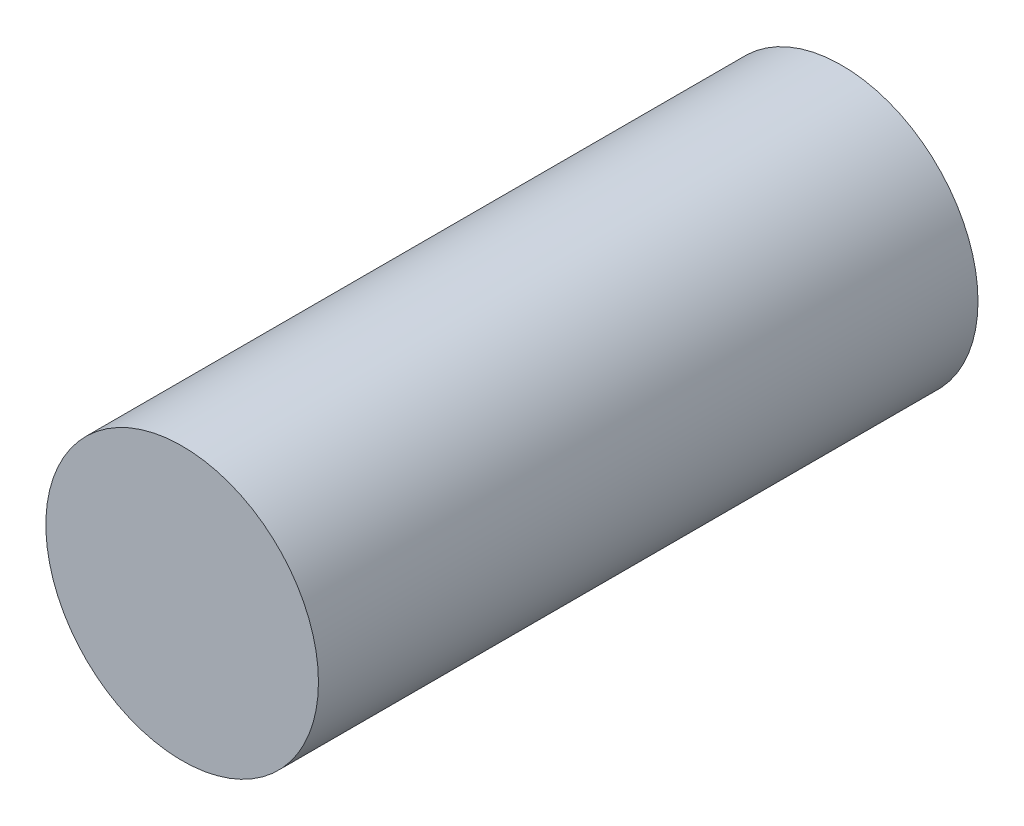
ISO-10303-21;
HEADER;
FILE_DESCRIPTION(('STEP AP214'),'2;1');
FILE_NAME('part.step','',(''),(''),'','','');
FILE_SCHEMA(('AUTOMOTIVE_DESIGN { 1 0 10303 214 1 1 1 1 }'));
ENDSEC;
DATA;
#1=APPLICATION_CONTEXT('core data for automotive mechanical design processes');
#2=APPLICATION_PROTOCOL_DEFINITION('international standard','automotive_design',2000,#1);
#3=PRODUCT_CONTEXT('',#1,'mechanical');
#4=PRODUCT('Part','Part','',(#3));
#5=PRODUCT_RELATED_PRODUCT_CATEGORY('part','',(#4));
#6=PRODUCT_DEFINITION_FORMATION('','',#4);
#7=PRODUCT_DEFINITION_CONTEXT('part definition',#1,'design');
#8=PRODUCT_DEFINITION('design','',#6,#7);
#9=PRODUCT_DEFINITION_SHAPE('','',#8);
#10=(LENGTH_UNIT() NAMED_UNIT(*) SI_UNIT(.MILLI.,.METRE.));
#11=(NAMED_UNIT(*) PLANE_ANGLE_UNIT() SI_UNIT($,.RADIAN.));
#12=(NAMED_UNIT(*) SI_UNIT($,.STERADIAN.) SOLID_ANGLE_UNIT());
#13=UNCERTAINTY_MEASURE_WITH_UNIT(LENGTH_MEASURE(1.E-05),#10,'distance_accuracy_value','');
#14=(GEOMETRIC_REPRESENTATION_CONTEXT(3) GLOBAL_UNCERTAINTY_ASSIGNED_CONTEXT((#13)) GLOBAL_UNIT_ASSIGNED_CONTEXT((#10,
#11,#12)) REPRESENTATION_CONTEXT('',''));
#15=CARTESIAN_POINT('',(0.,0.,0.));
#16=DIRECTION('',(0.,0.,1.));
#17=DIRECTION('',(1.,0.,0.));
#18=AXIS2_PLACEMENT_3D('',#15,#16,#17);
#19=CARTESIAN_POINT('',(0.,0.,7.5));
#20=DIRECTION('',(0.,0.,-1.));
#21=DIRECTION('',(-1.,0.,0.));
#22=AXIS2_PLACEMENT_3D('',#19,#20,#21);
#23=CYLINDRICAL_SURFACE('',#22,1.55);
#24=CARTESIAN_POINT('',(0.,0.,7.5));
#25=DIRECTION('',(0.,0.,1.));
#26=DIRECTION('',(1.,0.,0.));
#27=AXIS2_PLACEMENT_3D('',#24,#25,#26);
#28=CIRCLE('',#27,1.55);
#29=CARTESIAN_POINT('',(1.55,0.,7.5));
#30=VERTEX_POINT('',#29);
#31=EDGE_CURVE('E10',#30,#30,#28,.T.);
#32=ORIENTED_EDGE('',*,*,#31,.F.);
#33=EDGE_LOOP('',(#32));
#34=FACE_BOUND('',#33,.T.);
#35=CARTESIAN_POINT('',(0.,0.,0.));
#36=DIRECTION('',(0.,0.,1.));
#37=DIRECTION('',(1.,0.,0.));
#38=AXIS2_PLACEMENT_3D('',#35,#36,#37);
#39=CIRCLE('',#38,1.55);
#40=CARTESIAN_POINT('',(1.55,0.,0.));
#41=VERTEX_POINT('',#40);
#42=EDGE_CURVE('E34',#41,#41,#39,.T.);
#43=ORIENTED_EDGE('',*,*,#42,.T.);
#44=EDGE_LOOP('',(#43));
#45=FACE_BOUND('',#44,.T.);
#46=ADVANCED_FACE('F31',(#34,#45),#23,.T.);
#47=CARTESIAN_POINT('',(0.,0.,7.5));
#48=DIRECTION('',(0.,0.,1.));
#49=DIRECTION('',(1.,0.,0.));
#50=AXIS2_PLACEMENT_3D('',#47,#48,#49);
#51=PLANE('',#50);
#52=ORIENTED_EDGE('',*,*,#31,.T.);
#53=EDGE_LOOP('',(#52));
#54=FACE_BOUND('',#53,.T.);
#55=ADVANCED_FACE('F46',(#54),#51,.T.);
#56=CARTESIAN_POINT('',(0.,0.,0.));
#57=DIRECTION('',(0.,0.,1.));
#58=DIRECTION('',(1.,0.,0.));
#59=AXIS2_PLACEMENT_3D('',#56,#57,#58);
#60=PLANE('',#59);
#61=ORIENTED_EDGE('',*,*,#42,.F.);
#62=EDGE_LOOP('',(#61));
#63=FACE_BOUND('',#62,.T.);
#64=ADVANCED_FACE('F44',(#63),#60,.F.);
#65=CLOSED_SHELL('',(#46,#55,#64));
#66=MANIFOLD_SOLID_BREP('B2',#65);
#67=ADVANCED_BREP_SHAPE_REPRESENTATION('',(#18,#66),#14);
#68=SHAPE_DEFINITION_REPRESENTATION(#9,#67);
ENDSEC;
END-ISO-10303-21;
